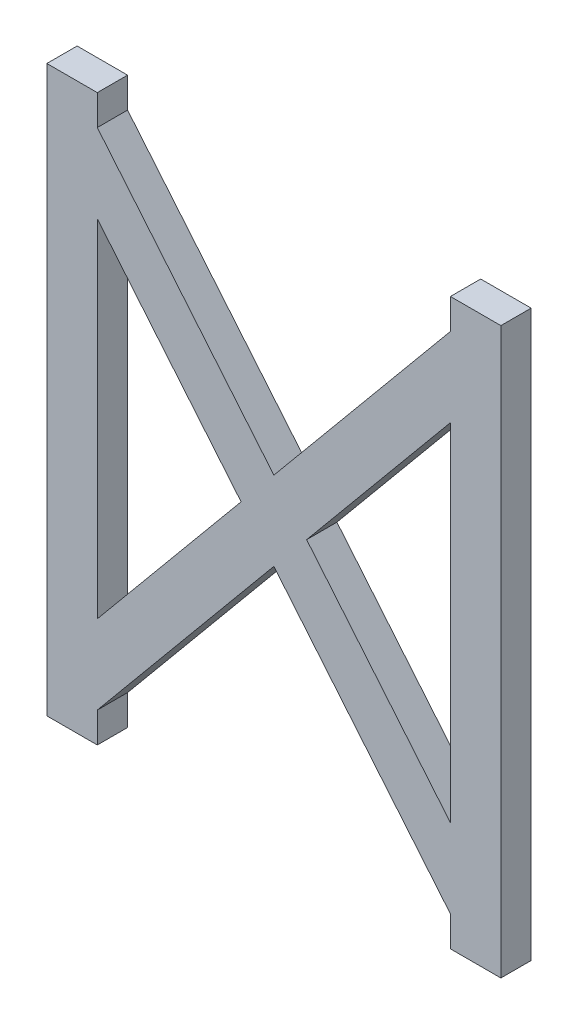
ISO-10303-21;
HEADER;
FILE_DESCRIPTION(('STEP AP214'),'2;1');
FILE_NAME('part.step','',(''),(''),'','','');
FILE_SCHEMA(('AUTOMOTIVE_DESIGN { 1 0 10303 214 1 1 1 1 }'));
ENDSEC;
DATA;
#1=APPLICATION_CONTEXT('core data for automotive mechanical design processes');
#2=APPLICATION_PROTOCOL_DEFINITION('international standard','automotive_design',2000,#1);
#3=PRODUCT_CONTEXT('',#1,'mechanical');
#4=PRODUCT('Part','Part','',(#3));
#5=PRODUCT_RELATED_PRODUCT_CATEGORY('part','',(#4));
#6=PRODUCT_DEFINITION_FORMATION('','',#4);
#7=PRODUCT_DEFINITION_CONTEXT('part definition',#1,'design');
#8=PRODUCT_DEFINITION('design','',#6,#7);
#9=PRODUCT_DEFINITION_SHAPE('','',#8);
#10=(LENGTH_UNIT() NAMED_UNIT(*) SI_UNIT(.MILLI.,.METRE.));
#11=(NAMED_UNIT(*) PLANE_ANGLE_UNIT() SI_UNIT($,.RADIAN.));
#12=(NAMED_UNIT(*) SI_UNIT($,.STERADIAN.) SOLID_ANGLE_UNIT());
#13=UNCERTAINTY_MEASURE_WITH_UNIT(LENGTH_MEASURE(1.E-05),#10,'distance_accuracy_value','');
#14=(GEOMETRIC_REPRESENTATION_CONTEXT(3) GLOBAL_UNCERTAINTY_ASSIGNED_CONTEXT((#13)) GLOBAL_UNIT_ASSIGNED_CONTEXT((#10,
#11,#12)) REPRESENTATION_CONTEXT('',''));
#15=CARTESIAN_POINT('',(0.,0.,0.));
#16=DIRECTION('',(0.,0.,1.));
#17=DIRECTION('',(1.,0.,0.));
#18=AXIS2_PLACEMENT_3D('',#15,#16,#17);
#19=CARTESIAN_POINT('',(25.1594245752413,20.881185156032,3.));
#20=DIRECTION('',(0.769498326214526,0.638648828350168,0.));
#21=DIRECTION('',(-0.638648828350168,0.769498326214526,0.));
#22=AXIS2_PLACEMENT_3D('',#19,#20,#21);
#23=PLANE('',#22);
#24=DIRECTION('',(0.638648828350168,-0.769498326214526,0.));
#25=VECTOR('',#24,1.);
#26=CARTESIAN_POINT('',(25.1594245752413,20.881185156032,0.));
#27=LINE('',#26,#25);
#28=CARTESIAN_POINT('',(5.,45.1709713099818,0.));
#29=VERTEX_POINT('',#28);
#30=CARTESIAN_POINT('',(19.2511300352029,28.,0.));
#31=VERTEX_POINT('',#30);
#32=EDGE_CURVE('E184',#29,#31,#27,.T.);
#33=ORIENTED_EDGE('',*,*,#32,.T.);
#34=DIRECTION('',(0.,0.,-1.));
#35=VECTOR('',#34,1.);
#36=CARTESIAN_POINT('',(19.2511300352029,28.,3.));
#37=LINE('',#36,#35);
#38=CARTESIAN_POINT('',(19.2511300352029,28.,3.));
#39=VERTEX_POINT('',#38);
#40=EDGE_CURVE('E11',#39,#31,#37,.T.);
#41=ORIENTED_EDGE('',*,*,#40,.F.);
#42=DIRECTION('',(0.638648828350168,-0.769498326214526,0.));
#43=VECTOR('',#42,1.);
#44=CARTESIAN_POINT('',(25.1594245752413,20.881185156032,3.));
#45=LINE('',#44,#43);
#46=CARTESIAN_POINT('',(5.,45.1709713099818,3.));
#47=VERTEX_POINT('',#46);
#48=EDGE_CURVE('E176',#47,#39,#45,.T.);
#49=ORIENTED_EDGE('',*,*,#48,.F.);
#50=DIRECTION('',(0.,0.,-1.));
#51=VECTOR('',#50,1.);
#52=CARTESIAN_POINT('',(5.,45.1709713099818,3.));
#53=LINE('',#52,#51);
#54=EDGE_CURVE('E52',#47,#29,#53,.T.);
#55=ORIENTED_EDGE('',*,*,#54,.T.);
#56=EDGE_LOOP('',(#33,#41,#49,#55));
#57=FACE_BOUND('',#56,.T.);
#58=ADVANCED_FACE('F33',(#57),#23,.F.);
#59=CARTESIAN_POINT('',(-2.36117087420081,1.95966509733836,3.));
#60=DIRECTION('',(-0.769498326214526,0.638648828350168,0.));
#61=DIRECTION('',(-0.638648828350168,-0.769498326214526,0.));
#62=AXIS2_PLACEMENT_3D('',#59,#60,#61);
#63=PLANE('',#62);
#64=DIRECTION('',(0.638648828350168,0.769498326214526,0.));
#65=VECTOR('',#64,1.);
#66=CARTESIAN_POINT('',(-2.36117087420081,1.95966509733836,0.));
#67=LINE('',#66,#65);
#68=CARTESIAN_POINT('',(5.00000000000001,10.8290286900182,0.));
#69=VERTEX_POINT('',#68);
#70=EDGE_CURVE('E245',#69,#31,#67,.T.);
#71=ORIENTED_EDGE('',*,*,#70,.F.);
#72=DIRECTION('',(0.,0.,-1.));
#73=VECTOR('',#72,1.);
#74=CARTESIAN_POINT('',(5.00000000000001,10.8290286900182,3.));
#75=LINE('',#74,#73);
#76=CARTESIAN_POINT('',(5.00000000000001,10.8290286900182,3.));
#77=VERTEX_POINT('',#76);
#78=EDGE_CURVE('E43',#77,#69,#75,.T.);
#79=ORIENTED_EDGE('',*,*,#78,.F.);
#80=DIRECTION('',(0.638648828350168,0.769498326214526,0.));
#81=VECTOR('',#80,1.);
#82=CARTESIAN_POINT('',(-2.36117087420081,1.95966509733836,3.));
#83=LINE('',#82,#81);
#84=EDGE_CURVE('E180',#77,#39,#83,.T.);
#85=ORIENTED_EDGE('',*,*,#84,.T.);
#86=ORIENTED_EDGE('',*,*,#40,.T.);
#87=EDGE_LOOP('',(#71,#79,#85,#86));
#88=FACE_BOUND('',#87,.T.);
#89=ADVANCED_FACE('F187',(#88),#63,.T.);
#90=CARTESIAN_POINT('',(1.48632075687182,-1.23357904441248,3.));
#91=DIRECTION('',(-0.769498326214526,0.638648828350168,0.));
#92=DIRECTION('',(-0.638648828350168,-0.769498326214526,0.));
#93=AXIS2_PLACEMENT_3D('',#90,#91,#92);
#94=PLANE('',#93);
#95=DIRECTION('',(0.638648828350168,0.769498326214526,0.));
#96=VECTOR('',#95,1.);
#97=CARTESIAN_POINT('',(1.48632075687182,-1.23357904441248,0.));
#98=LINE('',#97,#96);
#99=CARTESIAN_POINT('',(5.00000000000001,3.00000000000002,0.));
#100=VERTEX_POINT('',#99);
#101=CARTESIAN_POINT('',(22.5,24.0854856549909,0.));
#102=VERTEX_POINT('',#101);
#103=EDGE_CURVE('E204',#100,#102,#98,.T.);
#104=ORIENTED_EDGE('',*,*,#103,.T.);
#105=DIRECTION('',(0.,0.,-1.));
#106=VECTOR('',#105,1.);
#107=CARTESIAN_POINT('',(22.5,24.0854856549909,3.));
#108=LINE('',#107,#106);
#109=CARTESIAN_POINT('',(22.5,24.0854856549909,3.));
#110=VERTEX_POINT('',#109);
#111=EDGE_CURVE('E248',#110,#102,#108,.T.);
#112=ORIENTED_EDGE('',*,*,#111,.F.);
#113=DIRECTION('',(0.638648828350168,0.769498326214526,0.));
#114=VECTOR('',#113,1.);
#115=CARTESIAN_POINT('',(1.48632075687182,-1.23357904441248,3.));
#116=LINE('',#115,#114);
#117=CARTESIAN_POINT('',(5.00000000000001,3.00000000000002,3.));
#118=VERTEX_POINT('',#117);
#119=EDGE_CURVE('E339',#118,#110,#116,.T.);
#120=ORIENTED_EDGE('',*,*,#119,.F.);
#121=DIRECTION('',(0.,0.,-1.));
#122=VECTOR('',#121,1.);
#123=CARTESIAN_POINT('',(5.00000000000001,3.00000000000002,3.));
#124=LINE('',#123,#122);
#125=EDGE_CURVE('E250',#118,#100,#124,.T.);
#126=ORIENTED_EDGE('',*,*,#125,.T.);
#127=EDGE_LOOP('',(#104,#112,#120,#126));
#128=FACE_BOUND('',#127,.T.);
#129=ADVANCED_FACE('F349',(#128),#94,.F.);
#130=CARTESIAN_POINT('',(25.1594245752413,20.881185156032,3.));
#131=DIRECTION('',(0.769498326214526,0.638648828350168,0.));
#132=DIRECTION('',(-0.638648828350168,0.769498326214526,0.));
#133=AXIS2_PLACEMENT_3D('',#130,#131,#132);
#134=PLANE('',#133);
#135=DIRECTION('',(0.638648828350168,-0.769498326214526,0.));
#136=VECTOR('',#135,1.);
#137=CARTESIAN_POINT('',(25.1594245752413,20.881185156032,0.));
#138=LINE('',#137,#136);
#139=CARTESIAN_POINT('',(40.,2.99999999999998,0.));
#140=VERTEX_POINT('',#139);
#141=EDGE_CURVE('E207',#102,#140,#138,.T.);
#142=ORIENTED_EDGE('',*,*,#141,.T.);
#143=DIRECTION('',(0.,0.,-1.));
#144=VECTOR('',#143,1.);
#145=CARTESIAN_POINT('',(40.,2.99999999999998,3.));
#146=LINE('',#145,#144);
#147=CARTESIAN_POINT('',(40.,2.99999999999998,3.));
#148=VERTEX_POINT('',#147);
#149=EDGE_CURVE('E274',#148,#140,#146,.T.);
#150=ORIENTED_EDGE('',*,*,#149,.F.);
#151=DIRECTION('',(0.638648828350168,-0.769498326214526,0.));
#152=VECTOR('',#151,1.);
#153=CARTESIAN_POINT('',(25.1594245752413,20.881185156032,3.));
#154=LINE('',#153,#152);
#155=EDGE_CURVE('E350',#110,#148,#154,.T.);
#156=ORIENTED_EDGE('',*,*,#155,.F.);
#157=ORIENTED_EDGE('',*,*,#111,.T.);
#158=EDGE_LOOP('',(#142,#150,#156,#157));
#159=FACE_BOUND('',#158,.T.);
#160=ADVANCED_FACE('F435',(#159),#134,.F.);
#161=CARTESIAN_POINT('',(40.,0.,3.));
#162=DIRECTION('',(-1.,0.,0.));
#163=DIRECTION('',(0.,0.,1.));
#164=AXIS2_PLACEMENT_3D('',#161,#162,#163);
#165=PLANE('',#164);
#166=DIRECTION('',(0.,1.,0.));
#167=VECTOR('',#166,1.);
#168=CARTESIAN_POINT('',(40.,0.,0.));
#169=LINE('',#168,#167);
#170=CARTESIAN_POINT('',(40.,0.,0.));
#171=VERTEX_POINT('',#170);
#172=EDGE_CURVE('E210',#171,#140,#169,.T.);
#173=ORIENTED_EDGE('',*,*,#172,.F.);
#174=DIRECTION('',(0.,0.,-1.));
#175=VECTOR('',#174,1.);
#176=CARTESIAN_POINT('',(40.,0.,3.));
#177=LINE('',#176,#175);
#178=CARTESIAN_POINT('',(40.,0.,3.));
#179=VERTEX_POINT('',#178);
#180=EDGE_CURVE('E272',#179,#171,#177,.T.);
#181=ORIENTED_EDGE('',*,*,#180,.F.);
#182=DIRECTION('',(0.,1.,0.));
#183=VECTOR('',#182,1.);
#184=CARTESIAN_POINT('',(40.,0.,3.));
#185=LINE('',#184,#183);
#186=EDGE_CURVE('E352',#179,#148,#185,.T.);
#187=ORIENTED_EDGE('',*,*,#186,.T.);
#188=ORIENTED_EDGE('',*,*,#149,.T.);
#189=EDGE_LOOP('',(#173,#181,#187,#188));
#190=FACE_BOUND('',#189,.T.);
#191=ADVANCED_FACE('F432',(#190),#165,.T.);
#192=CARTESIAN_POINT('',(0.,0.,3.));
#193=DIRECTION('',(0.,-1.,0.));
#194=DIRECTION('',(1.,0.,0.));
#195=AXIS2_PLACEMENT_3D('',#192,#193,#194);
#196=PLANE('',#195);
#197=DIRECTION('',(-1.,0.,0.));
#198=VECTOR('',#197,1.);
#199=CARTESIAN_POINT('',(0.,0.,0.));
#200=LINE('',#199,#198);
#201=CARTESIAN_POINT('',(45.,0.,0.));
#202=VERTEX_POINT('',#201);
#203=EDGE_CURVE('E213',#202,#171,#200,.T.);
#204=ORIENTED_EDGE('',*,*,#203,.F.);
#205=DIRECTION('',(0.,0.,-1.));
#206=VECTOR('',#205,1.);
#207=CARTESIAN_POINT('',(45.,0.,3.));
#208=LINE('',#207,#206);
#209=CARTESIAN_POINT('',(45.,0.,3.));
#210=VERTEX_POINT('',#209);
#211=EDGE_CURVE('E270',#210,#202,#208,.T.);
#212=ORIENTED_EDGE('',*,*,#211,.F.);
#213=DIRECTION('',(-1.,0.,0.));
#214=VECTOR('',#213,1.);
#215=CARTESIAN_POINT('',(0.,0.,3.));
#216=LINE('',#215,#214);
#217=EDGE_CURVE('E314',#210,#179,#216,.T.);
#218=ORIENTED_EDGE('',*,*,#217,.T.);
#219=ORIENTED_EDGE('',*,*,#180,.T.);
#220=EDGE_LOOP('',(#204,#212,#218,#219));
#221=FACE_BOUND('',#220,.T.);
#222=ADVANCED_FACE('F361',(#221),#196,.T.);
#223=CARTESIAN_POINT('',(45.,0.,3.));
#224=DIRECTION('',(1.,0.,0.));
#225=DIRECTION('',(0.,1.,0.));
#226=AXIS2_PLACEMENT_3D('',#223,#224,#225);
#227=PLANE('',#226);
#228=DIRECTION('',(0.,-1.,0.));
#229=VECTOR('',#228,1.);
#230=CARTESIAN_POINT('',(45.,0.,0.));
#231=LINE('',#230,#229);
#232=CARTESIAN_POINT('',(45.,56.,0.));
#233=VERTEX_POINT('',#232);
#234=EDGE_CURVE('E216',#233,#202,#231,.T.);
#235=ORIENTED_EDGE('',*,*,#234,.F.);
#236=DIRECTION('',(0.,0.,-1.));
#237=VECTOR('',#236,1.);
#238=CARTESIAN_POINT('',(45.,56.,3.));
#239=LINE('',#238,#237);
#240=CARTESIAN_POINT('',(45.,56.,3.));
#241=VERTEX_POINT('',#240);
#242=EDGE_CURVE('E268',#241,#233,#239,.T.);
#243=ORIENTED_EDGE('',*,*,#242,.F.);
#244=DIRECTION('',(0.,-1.,0.));
#245=VECTOR('',#244,1.);
#246=CARTESIAN_POINT('',(45.,0.,3.));
#247=LINE('',#246,#245);
#248=EDGE_CURVE('E309',#241,#210,#247,.T.);
#249=ORIENTED_EDGE('',*,*,#248,.T.);
#250=ORIENTED_EDGE('',*,*,#211,.T.);
#251=EDGE_LOOP('',(#235,#243,#249,#250));
#252=FACE_BOUND('',#251,.T.);
#253=ADVANCED_FACE('F367',(#252),#227,.T.);
#254=CARTESIAN_POINT('',(0.,56.,3.));
#255=DIRECTION('',(0.,1.,0.));
#256=DIRECTION('',(0.,0.,1.));
#257=AXIS2_PLACEMENT_3D('',#254,#255,#256);
#258=PLANE('',#257);
#259=DIRECTION('',(1.,0.,0.));
#260=VECTOR('',#259,1.);
#261=CARTESIAN_POINT('',(0.,56.,0.));
#262=LINE('',#261,#260);
#263=CARTESIAN_POINT('',(40.,56.,0.));
#264=VERTEX_POINT('',#263);
#265=EDGE_CURVE('E219',#264,#233,#262,.T.);
#266=ORIENTED_EDGE('',*,*,#265,.F.);
#267=DIRECTION('',(0.,0.,-1.));
#268=VECTOR('',#267,1.);
#269=CARTESIAN_POINT('',(40.,56.,3.));
#270=LINE('',#269,#268);
#271=CARTESIAN_POINT('',(40.,56.,3.));
#272=VERTEX_POINT('',#271);
#273=EDGE_CURVE('E266',#272,#264,#270,.T.);
#274=ORIENTED_EDGE('',*,*,#273,.F.);
#275=DIRECTION('',(1.,0.,0.));
#276=VECTOR('',#275,1.);
#277=CARTESIAN_POINT('',(0.,56.,3.));
#278=LINE('',#277,#276);
#279=EDGE_CURVE('E302',#272,#241,#278,.T.);
#280=ORIENTED_EDGE('',*,*,#279,.T.);
#281=ORIENTED_EDGE('',*,*,#242,.T.);
#282=EDGE_LOOP('',(#266,#274,#280,#281));
#283=FACE_BOUND('',#282,.T.);
#284=ADVANCED_FACE('F369',(#283),#258,.T.);
#285=CARTESIAN_POINT('',(40.,0.,3.));
#286=DIRECTION('',(-1.,0.,0.));
#287=DIRECTION('',(0.,0.,1.));
#288=AXIS2_PLACEMENT_3D('',#285,#286,#287);
#289=PLANE('',#288);
#290=DIRECTION('',(0.,1.,0.));
#291=VECTOR('',#290,1.);
#292=CARTESIAN_POINT('',(40.,0.,0.));
#293=LINE('',#292,#291);
#294=CARTESIAN_POINT('',(40.,53.,0.));
#295=VERTEX_POINT('',#294);
#296=EDGE_CURVE('E198',#295,#264,#293,.T.);
#297=ORIENTED_EDGE('',*,*,#296,.F.);
#298=DIRECTION('',(0.,0.,-1.));
#299=VECTOR('',#298,1.);
#300=CARTESIAN_POINT('',(40.,53.,3.));
#301=LINE('',#300,#299);
#302=CARTESIAN_POINT('',(40.,53.,3.));
#303=VERTEX_POINT('',#302);
#304=EDGE_CURVE('E264',#303,#295,#301,.T.);
#305=ORIENTED_EDGE('',*,*,#304,.F.);
#306=DIRECTION('',(0.,1.,0.));
#307=VECTOR('',#306,1.);
#308=CARTESIAN_POINT('',(40.,0.,3.));
#309=LINE('',#308,#307);
#310=EDGE_CURVE('E297',#303,#272,#309,.T.);
#311=ORIENTED_EDGE('',*,*,#310,.T.);
#312=ORIENTED_EDGE('',*,*,#273,.T.);
#313=EDGE_LOOP('',(#297,#305,#311,#312));
#314=FACE_BOUND('',#313,.T.);
#315=ADVANCED_FACE('F373',(#314),#289,.T.);
#316=CARTESIAN_POINT('',(-2.36117087420081,1.95966509733836,3.));
#317=DIRECTION('',(-0.769498326214526,0.638648828350168,0.));
#318=DIRECTION('',(-0.638648828350168,-0.769498326214526,0.));
#319=AXIS2_PLACEMENT_3D('',#316,#317,#318);
#320=PLANE('',#319);
#321=DIRECTION('',(0.638648828350168,0.769498326214526,0.));
#322=VECTOR('',#321,1.);
#323=CARTESIAN_POINT('',(-2.36117087420081,1.95966509733836,0.));
#324=LINE('',#323,#322);
#325=CARTESIAN_POINT('',(22.5,31.9145143450091,0.));
#326=VERTEX_POINT('',#325);
#327=EDGE_CURVE('E222',#326,#295,#324,.T.);
#328=ORIENTED_EDGE('',*,*,#327,.F.);
#329=DIRECTION('',(0.,0.,-1.));
#330=VECTOR('',#329,1.);
#331=CARTESIAN_POINT('',(22.5,31.9145143450091,3.));
#332=LINE('',#331,#330);
#333=CARTESIAN_POINT('',(22.5,31.9145143450091,3.));
#334=VERTEX_POINT('',#333);
#335=EDGE_CURVE('E262',#334,#326,#332,.T.);
#336=ORIENTED_EDGE('',*,*,#335,.F.);
#337=DIRECTION('',(0.638648828350168,0.769498326214526,0.));
#338=VECTOR('',#337,1.);
#339=CARTESIAN_POINT('',(-2.36117087420081,1.95966509733836,3.));
#340=LINE('',#339,#338);
#341=EDGE_CURVE('E301',#334,#303,#340,.T.);
#342=ORIENTED_EDGE('',*,*,#341,.T.);
#343=ORIENTED_EDGE('',*,*,#304,.T.);
#344=EDGE_LOOP('',(#328,#336,#342,#343));
#345=FACE_BOUND('',#344,.T.);
#346=ADVANCED_FACE('F377',(#345),#320,.T.);
#347=CARTESIAN_POINT('',(29.0069162063139,24.0744292977829,3.));
#348=DIRECTION('',(0.769498326214526,0.638648828350168,0.));
#349=DIRECTION('',(-0.638648828350168,0.769498326214526,0.));
#350=AXIS2_PLACEMENT_3D('',#347,#348,#349);
#351=PLANE('',#350);
#352=DIRECTION('',(0.638648828350168,-0.769498326214526,0.));
#353=VECTOR('',#352,1.);
#354=CARTESIAN_POINT('',(29.0069162063139,24.0744292977829,0.));
#355=LINE('',#354,#353);
#356=CARTESIAN_POINT('',(5.,53.,0.));
#357=VERTEX_POINT('',#356);
#358=EDGE_CURVE('E225',#357,#326,#355,.T.);
#359=ORIENTED_EDGE('',*,*,#358,.F.);
#360=DIRECTION('',(0.,0.,-1.));
#361=VECTOR('',#360,1.);
#362=CARTESIAN_POINT('',(5.,53.,3.));
#363=LINE('',#362,#361);
#364=CARTESIAN_POINT('',(5.,53.,3.));
#365=VERTEX_POINT('',#364);
#366=EDGE_CURVE('E260',#365,#357,#363,.T.);
#367=ORIENTED_EDGE('',*,*,#366,.F.);
#368=DIRECTION('',(0.638648828350168,-0.769498326214526,0.));
#369=VECTOR('',#368,1.);
#370=CARTESIAN_POINT('',(29.0069162063139,24.0744292977829,3.));
#371=LINE('',#370,#369);
#372=EDGE_CURVE('E306',#365,#334,#371,.T.);
#373=ORIENTED_EDGE('',*,*,#372,.T.);
#374=ORIENTED_EDGE('',*,*,#335,.T.);
#375=EDGE_LOOP('',(#359,#367,#373,#374));
#376=FACE_BOUND('',#375,.T.);
#377=ADVANCED_FACE('F380',(#376),#351,.T.);
#378=CARTESIAN_POINT('',(5.00000000000001,0.,3.));
#379=DIRECTION('',(1.,0.,0.));
#380=DIRECTION('',(0.,1.,0.));
#381=AXIS2_PLACEMENT_3D('',#378,#379,#380);
#382=PLANE('',#381);
#383=DIRECTION('',(0.,-1.,0.));
#384=VECTOR('',#383,1.);
#385=CARTESIAN_POINT('',(5.00000000000001,0.,0.));
#386=LINE('',#385,#384);
#387=CARTESIAN_POINT('',(5.,56.,0.));
#388=VERTEX_POINT('',#387);
#389=EDGE_CURVE('E228',#388,#357,#386,.T.);
#390=ORIENTED_EDGE('',*,*,#389,.F.);
#391=DIRECTION('',(0.,0.,-1.));
#392=VECTOR('',#391,1.);
#393=CARTESIAN_POINT('',(5.,56.,3.));
#394=LINE('',#393,#392);
#395=CARTESIAN_POINT('',(5.,56.,3.));
#396=VERTEX_POINT('',#395);
#397=EDGE_CURVE('E258',#396,#388,#394,.T.);
#398=ORIENTED_EDGE('',*,*,#397,.F.);
#399=DIRECTION('',(0.,-1.,0.));
#400=VECTOR('',#399,1.);
#401=CARTESIAN_POINT('',(5.00000000000001,0.,3.));
#402=LINE('',#401,#400);
#403=EDGE_CURVE('E191',#396,#365,#402,.T.);
#404=ORIENTED_EDGE('',*,*,#403,.T.);
#405=ORIENTED_EDGE('',*,*,#366,.T.);
#406=EDGE_LOOP('',(#390,#398,#404,#405));
#407=FACE_BOUND('',#406,.T.);
#408=ADVANCED_FACE('F384',(#407),#382,.T.);
#409=CARTESIAN_POINT('',(0.,56.,3.));
#410=DIRECTION('',(0.,1.,0.));
#411=DIRECTION('',(0.,0.,1.));
#412=AXIS2_PLACEMENT_3D('',#409,#410,#411);
#413=PLANE('',#412);
#414=DIRECTION('',(1.,0.,0.));
#415=VECTOR('',#414,1.);
#416=CARTESIAN_POINT('',(0.,56.,0.));
#417=LINE('',#416,#415);
#418=CARTESIAN_POINT('',(0.,56.,0.));
#419=VERTEX_POINT('',#418);
#420=EDGE_CURVE('E231',#419,#388,#417,.T.);
#421=ORIENTED_EDGE('',*,*,#420,.F.);
#422=DIRECTION('',(0.,0.,-1.));
#423=VECTOR('',#422,1.);
#424=CARTESIAN_POINT('',(0.,56.,3.));
#425=LINE('',#424,#423);
#426=CARTESIAN_POINT('',(0.,56.,3.));
#427=VERTEX_POINT('',#426);
#428=EDGE_CURVE('E256',#427,#419,#425,.T.);
#429=ORIENTED_EDGE('',*,*,#428,.F.);
#430=DIRECTION('',(1.,0.,0.));
#431=VECTOR('',#430,1.);
#432=CARTESIAN_POINT('',(0.,56.,3.));
#433=LINE('',#432,#431);
#434=EDGE_CURVE('E321',#427,#396,#433,.T.);
#435=ORIENTED_EDGE('',*,*,#434,.T.);
#436=ORIENTED_EDGE('',*,*,#397,.T.);
#437=EDGE_LOOP('',(#421,#429,#435,#436));
#438=FACE_BOUND('',#437,.T.);
#439=ADVANCED_FACE('F387',(#438),#413,.T.);
#440=CARTESIAN_POINT('',(0.,0.,3.));
#441=DIRECTION('',(-1.,0.,0.));
#442=DIRECTION('',(0.,0.,1.));
#443=AXIS2_PLACEMENT_3D('',#440,#441,#442);
#444=PLANE('',#443);
#445=DIRECTION('',(0.,1.,0.));
#446=VECTOR('',#445,1.);
#447=CARTESIAN_POINT('',(0.,0.,0.));
#448=LINE('',#447,#446);
#449=CARTESIAN_POINT('',(0.,0.,0.));
#450=VERTEX_POINT('',#449);
#451=EDGE_CURVE('E235',#450,#419,#448,.T.);
#452=ORIENTED_EDGE('',*,*,#451,.F.);
#453=DIRECTION('',(0.,0.,-1.));
#454=VECTOR('',#453,1.);
#455=CARTESIAN_POINT('',(0.,0.,3.));
#456=LINE('',#455,#454);
#457=CARTESIAN_POINT('',(0.,0.,3.));
#458=VERTEX_POINT('',#457);
#459=EDGE_CURVE('E254',#458,#450,#456,.T.);
#460=ORIENTED_EDGE('',*,*,#459,.F.);
#461=DIRECTION('',(0.,1.,0.));
#462=VECTOR('',#461,1.);
#463=CARTESIAN_POINT('',(0.,0.,3.));
#464=LINE('',#463,#462);
#465=EDGE_CURVE('E324',#458,#427,#464,.T.);
#466=ORIENTED_EDGE('',*,*,#465,.T.);
#467=ORIENTED_EDGE('',*,*,#428,.T.);
#468=EDGE_LOOP('',(#452,#460,#466,#467));
#469=FACE_BOUND('',#468,.T.);
#470=ADVANCED_FACE('F389',(#469),#444,.T.);
#471=CARTESIAN_POINT('',(0.,0.,3.));
#472=DIRECTION('',(0.,-1.,0.));
#473=DIRECTION('',(1.,0.,0.));
#474=AXIS2_PLACEMENT_3D('',#471,#472,#473);
#475=PLANE('',#474);
#476=DIRECTION('',(-1.,0.,0.));
#477=VECTOR('',#476,1.);
#478=CARTESIAN_POINT('',(0.,0.,0.));
#479=LINE('',#478,#477);
#480=CARTESIAN_POINT('',(5.00000000000001,0.,0.));
#481=VERTEX_POINT('',#480);
#482=EDGE_CURVE('E238',#481,#450,#479,.T.);
#483=ORIENTED_EDGE('',*,*,#482,.F.);
#484=DIRECTION('',(0.,0.,-1.));
#485=VECTOR('',#484,1.);
#486=CARTESIAN_POINT('',(5.00000000000001,0.,3.));
#487=LINE('',#486,#485);
#488=CARTESIAN_POINT('',(5.00000000000001,0.,3.));
#489=VERTEX_POINT('',#488);
#490=EDGE_CURVE('E252',#489,#481,#487,.T.);
#491=ORIENTED_EDGE('',*,*,#490,.F.);
#492=DIRECTION('',(-1.,0.,0.));
#493=VECTOR('',#492,1.);
#494=CARTESIAN_POINT('',(0.,0.,3.));
#495=LINE('',#494,#493);
#496=EDGE_CURVE('E327',#489,#458,#495,.T.);
#497=ORIENTED_EDGE('',*,*,#496,.T.);
#498=ORIENTED_EDGE('',*,*,#459,.T.);
#499=EDGE_LOOP('',(#483,#491,#497,#498));
#500=FACE_BOUND('',#499,.T.);
#501=ADVANCED_FACE('F344',(#500),#475,.T.);
#502=CARTESIAN_POINT('',(40.,10.8290286900182,0.));
#503=VERTEX_POINT('',#502);
#504=CARTESIAN_POINT('',(40.,45.1709713099818,0.));
#505=VERTEX_POINT('',#504);
#506=EDGE_CURVE('E194',#503,#505,#293,.T.);
#507=ORIENTED_EDGE('',*,*,#506,.F.);
#508=DIRECTION('',(0.,0.,-1.));
#509=VECTOR('',#508,1.);
#510=CARTESIAN_POINT('',(40.,10.8290286900182,3.));
#511=LINE('',#510,#509);
#512=CARTESIAN_POINT('',(40.,10.8290286900182,3.));
#513=VERTEX_POINT('',#512);
#514=EDGE_CURVE('E37',#513,#503,#511,.T.);
#515=ORIENTED_EDGE('',*,*,#514,.F.);
#516=CARTESIAN_POINT('',(40.,45.1709713099818,3.));
#517=VERTEX_POINT('',#516);
#518=EDGE_CURVE('E294',#513,#517,#309,.T.);
#519=ORIENTED_EDGE('',*,*,#518,.T.);
#520=DIRECTION('',(0.,0.,-1.));
#521=VECTOR('',#520,1.);
#522=CARTESIAN_POINT('',(40.,45.1709713099818,3.));
#523=LINE('',#522,#521);
#524=EDGE_CURVE('E189',#517,#505,#523,.T.);
#525=ORIENTED_EDGE('',*,*,#524,.T.);
#526=EDGE_LOOP('',(#507,#515,#519,#525));
#527=FACE_BOUND('',#526,.T.);
#528=ADVANCED_FACE('F287',(#527),#289,.T.);
#529=CARTESIAN_POINT('',(29.0069162063139,24.0744292977829,3.));
#530=DIRECTION('',(0.769498326214526,0.638648828350168,0.));
#531=DIRECTION('',(-0.638648828350168,0.769498326214526,0.));
#532=AXIS2_PLACEMENT_3D('',#529,#530,#531);
#533=PLANE('',#532);
#534=DIRECTION('',(0.638648828350168,-0.769498326214526,0.));
#535=VECTOR('',#534,1.);
#536=CARTESIAN_POINT('',(29.0069162063139,24.0744292977829,0.));
#537=LINE('',#536,#535);
#538=CARTESIAN_POINT('',(25.7488699647971,28.,0.));
#539=VERTEX_POINT('',#538);
#540=EDGE_CURVE('E197',#539,#503,#537,.T.);
#541=ORIENTED_EDGE('',*,*,#540,.F.);
#542=DIRECTION('',(0.,0.,-1.));
#543=VECTOR('',#542,1.);
#544=CARTESIAN_POINT('',(25.7488699647971,28.,3.));
#545=LINE('',#544,#543);
#546=CARTESIAN_POINT('',(25.7488699647971,28.,3.));
#547=VERTEX_POINT('',#546);
#548=EDGE_CURVE('E278',#547,#539,#545,.T.);
#549=ORIENTED_EDGE('',*,*,#548,.F.);
#550=DIRECTION('',(0.638648828350168,-0.769498326214526,0.));
#551=VECTOR('',#550,1.);
#552=CARTESIAN_POINT('',(29.0069162063139,24.0744292977829,3.));
#553=LINE('',#552,#551);
#554=EDGE_CURVE('E286',#547,#513,#553,.T.);
#555=ORIENTED_EDGE('',*,*,#554,.T.);
#556=ORIENTED_EDGE('',*,*,#514,.T.);
#557=EDGE_LOOP('',(#541,#549,#555,#556));
#558=FACE_BOUND('',#557,.T.);
#559=ADVANCED_FACE('F35',(#558),#533,.T.);
#560=CARTESIAN_POINT('',(5.00000000000001,0.,3.));
#561=DIRECTION('',(1.,0.,0.));
#562=DIRECTION('',(0.,1.,0.));
#563=AXIS2_PLACEMENT_3D('',#560,#561,#562);
#564=PLANE('',#563);
#565=DIRECTION('',(0.,-1.,0.));
#566=VECTOR('',#565,1.);
#567=CARTESIAN_POINT('',(5.00000000000001,0.,0.));
#568=LINE('',#567,#566);
#569=EDGE_CURVE('E241',#100,#481,#568,.T.);
#570=ORIENTED_EDGE('',*,*,#569,.F.);
#571=ORIENTED_EDGE('',*,*,#125,.F.);
#572=DIRECTION('',(0.,-1.,0.));
#573=VECTOR('',#572,1.);
#574=CARTESIAN_POINT('',(5.00000000000001,0.,3.));
#575=LINE('',#574,#573);
#576=EDGE_CURVE('E182',#118,#489,#575,.T.);
#577=ORIENTED_EDGE('',*,*,#576,.T.);
#578=ORIENTED_EDGE('',*,*,#490,.T.);
#579=EDGE_LOOP('',(#570,#571,#577,#578));
#580=FACE_BOUND('',#579,.T.);
#581=ADVANCED_FACE('F333',(#580),#564,.T.);
#582=CARTESIAN_POINT('',(1.48632075687182,-1.23357904441248,3.));
#583=DIRECTION('',(-0.769498326214526,0.638648828350168,0.));
#584=DIRECTION('',(-0.638648828350168,-0.769498326214526,0.));
#585=AXIS2_PLACEMENT_3D('',#582,#583,#584);
#586=PLANE('',#585);
#587=DIRECTION('',(0.638648828350168,0.769498326214526,0.));
#588=VECTOR('',#587,1.);
#589=CARTESIAN_POINT('',(1.48632075687182,-1.23357904441248,0.));
#590=LINE('',#589,#588);
#591=EDGE_CURVE('E201',#539,#505,#590,.T.);
#592=ORIENTED_EDGE('',*,*,#591,.T.);
#593=ORIENTED_EDGE('',*,*,#524,.F.);
#594=DIRECTION('',(0.638648828350168,0.769498326214526,0.));
#595=VECTOR('',#594,1.);
#596=CARTESIAN_POINT('',(1.48632075687182,-1.23357904441248,3.));
#597=LINE('',#596,#595);
#598=EDGE_CURVE('E293',#547,#517,#597,.T.);
#599=ORIENTED_EDGE('',*,*,#598,.F.);
#600=ORIENTED_EDGE('',*,*,#548,.T.);
#601=EDGE_LOOP('',(#592,#593,#599,#600));
#602=FACE_BOUND('',#601,.T.);
#603=ADVANCED_FACE('F292',(#602),#586,.F.);
#604=EDGE_CURVE('E232',#29,#69,#386,.T.);
#605=ORIENTED_EDGE('',*,*,#604,.F.);
#606=ORIENTED_EDGE('',*,*,#54,.F.);
#607=EDGE_CURVE('E181',#47,#77,#402,.T.);
#608=ORIENTED_EDGE('',*,*,#607,.T.);
#609=ORIENTED_EDGE('',*,*,#78,.T.);
#610=EDGE_LOOP('',(#605,#606,#608,#609));
#611=FACE_BOUND('',#610,.T.);
#612=ADVANCED_FACE('F411',(#611),#382,.T.);
#613=CARTESIAN_POINT('',(0.,0.,3.));
#614=DIRECTION('',(0.,0.,1.));
#615=DIRECTION('',(1.,0.,0.));
#616=AXIS2_PLACEMENT_3D('',#613,#614,#615);
#617=PLANE('',#616);
#618=ORIENTED_EDGE('',*,*,#518,.F.);
#619=ORIENTED_EDGE('',*,*,#554,.F.);
#620=ORIENTED_EDGE('',*,*,#598,.T.);
#621=EDGE_LOOP('',(#618,#619,#620));
#622=FACE_BOUND('',#621,.T.);
#623=ORIENTED_EDGE('',*,*,#119,.T.);
#624=ORIENTED_EDGE('',*,*,#155,.T.);
#625=ORIENTED_EDGE('',*,*,#186,.F.);
#626=ORIENTED_EDGE('',*,*,#217,.F.);
#627=ORIENTED_EDGE('',*,*,#248,.F.);
#628=ORIENTED_EDGE('',*,*,#279,.F.);
#629=ORIENTED_EDGE('',*,*,#310,.F.);
#630=ORIENTED_EDGE('',*,*,#341,.F.);
#631=ORIENTED_EDGE('',*,*,#372,.F.);
#632=ORIENTED_EDGE('',*,*,#403,.F.);
#633=ORIENTED_EDGE('',*,*,#434,.F.);
#634=ORIENTED_EDGE('',*,*,#465,.F.);
#635=ORIENTED_EDGE('',*,*,#496,.F.);
#636=ORIENTED_EDGE('',*,*,#576,.F.);
#637=EDGE_LOOP('',(#623,#624,#625,#626,#627,#628,#629,#630,#631,#632,#633,#634,#635,#636));
#638=FACE_BOUND('',#637,.T.);
#639=ORIENTED_EDGE('',*,*,#48,.T.);
#640=ORIENTED_EDGE('',*,*,#84,.F.);
#641=ORIENTED_EDGE('',*,*,#607,.F.);
#642=EDGE_LOOP('',(#639,#640,#641));
#643=FACE_BOUND('',#642,.T.);
#644=ADVANCED_FACE('F178',(#622,#638,#643),#617,.T.);
#645=CARTESIAN_POINT('',(0.,0.,0.));
#646=DIRECTION('',(0.,0.,1.));
#647=DIRECTION('',(1.,0.,0.));
#648=AXIS2_PLACEMENT_3D('',#645,#646,#647);
#649=PLANE('',#648);
#650=ORIENTED_EDGE('',*,*,#506,.T.);
#651=ORIENTED_EDGE('',*,*,#591,.F.);
#652=ORIENTED_EDGE('',*,*,#540,.T.);
#653=EDGE_LOOP('',(#650,#651,#652));
#654=FACE_BOUND('',#653,.T.);
#655=ORIENTED_EDGE('',*,*,#103,.F.);
#656=ORIENTED_EDGE('',*,*,#569,.T.);
#657=ORIENTED_EDGE('',*,*,#482,.T.);
#658=ORIENTED_EDGE('',*,*,#451,.T.);
#659=ORIENTED_EDGE('',*,*,#420,.T.);
#660=ORIENTED_EDGE('',*,*,#389,.T.);
#661=ORIENTED_EDGE('',*,*,#358,.T.);
#662=ORIENTED_EDGE('',*,*,#327,.T.);
#663=ORIENTED_EDGE('',*,*,#296,.T.);
#664=ORIENTED_EDGE('',*,*,#265,.T.);
#665=ORIENTED_EDGE('',*,*,#234,.T.);
#666=ORIENTED_EDGE('',*,*,#203,.T.);
#667=ORIENTED_EDGE('',*,*,#172,.T.);
#668=ORIENTED_EDGE('',*,*,#141,.F.);
#669=EDGE_LOOP('',(#655,#656,#657,#658,#659,#660,#661,#662,#663,#664,#665,#666,#667,#668));
#670=FACE_BOUND('',#669,.T.);
#671=ORIENTED_EDGE('',*,*,#32,.F.);
#672=ORIENTED_EDGE('',*,*,#604,.T.);
#673=ORIENTED_EDGE('',*,*,#70,.T.);
#674=EDGE_LOOP('',(#671,#672,#673));
#675=FACE_BOUND('',#674,.T.);
#676=ADVANCED_FACE('F290',(#654,#670,#675),#649,.F.);
#677=CLOSED_SHELL('',(#58,#89,#129,#160,#191,#222,#253,#284,#315,#346,#377,#408,#439,#470,#501,
#528,#559,#581,#603,#612,#644,#676));
#678=MANIFOLD_SOLID_BREP('B2',#677);
#679=ADVANCED_BREP_SHAPE_REPRESENTATION('',(#18,#678),#14);
#680=SHAPE_DEFINITION_REPRESENTATION(#9,#679);
ENDSEC;
END-ISO-10303-21;
